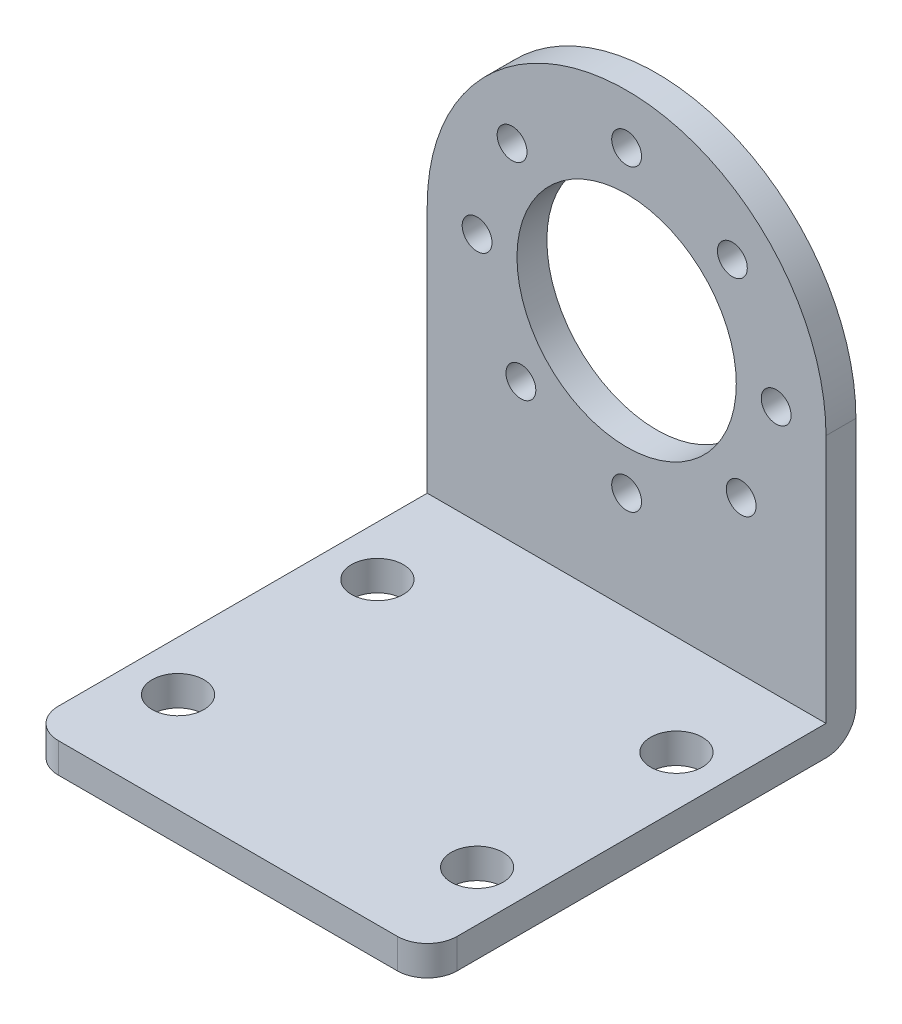
ISO-10303-21;
HEADER;
FILE_DESCRIPTION(('STEP AP214'),'2;1');
FILE_NAME('part.step','',(''),(''),'','','');
FILE_SCHEMA(('AUTOMOTIVE_DESIGN { 1 0 10303 214 1 1 1 1 }'));
ENDSEC;
DATA;
#1=APPLICATION_CONTEXT('core data for automotive mechanical design processes');
#2=APPLICATION_PROTOCOL_DEFINITION('international standard','automotive_design',2000,#1);
#3=PRODUCT_CONTEXT('',#1,'mechanical');
#4=PRODUCT('Part','Part','',(#3));
#5=PRODUCT_RELATED_PRODUCT_CATEGORY('part','',(#4));
#6=PRODUCT_DEFINITION_FORMATION('','',#4);
#7=PRODUCT_DEFINITION_CONTEXT('part definition',#1,'design');
#8=PRODUCT_DEFINITION('design','',#6,#7);
#9=PRODUCT_DEFINITION_SHAPE('','',#8);
#10=(LENGTH_UNIT() NAMED_UNIT(*) SI_UNIT(.MILLI.,.METRE.));
#11=(NAMED_UNIT(*) PLANE_ANGLE_UNIT() SI_UNIT($,.RADIAN.));
#12=(NAMED_UNIT(*) SI_UNIT($,.STERADIAN.) SOLID_ANGLE_UNIT());
#13=UNCERTAINTY_MEASURE_WITH_UNIT(LENGTH_MEASURE(1.E-05),#10,'distance_accuracy_value','');
#14=(GEOMETRIC_REPRESENTATION_CONTEXT(3) GLOBAL_UNCERTAINTY_ASSIGNED_CONTEXT((#13)) GLOBAL_UNIT_ASSIGNED_CONTEXT((#10,
#11,#12)) REPRESENTATION_CONTEXT('',''));
#15=CARTESIAN_POINT('',(0.,0.,0.));
#16=DIRECTION('',(0.,0.,1.));
#17=DIRECTION('',(1.,0.,0.));
#18=AXIS2_PLACEMENT_3D('',#15,#16,#17);
#19=CARTESIAN_POINT('',(0.,0.,3.));
#20=DIRECTION('',(0.,0.,1.));
#21=DIRECTION('',(1.,0.,0.));
#22=AXIS2_PLACEMENT_3D('',#19,#20,#21);
#23=PLANE('',#22);
#24=CARTESIAN_POINT('',(-15.,0.,3.));
#25=DIRECTION('',(0.,0.,1.));
#26=DIRECTION('',(1.,0.,0.));
#27=AXIS2_PLACEMENT_3D('',#24,#25,#26);
#28=CIRCLE('',#27,1.49741367936974);
#29=CARTESIAN_POINT('',(-13.5025863206303,0.,3.));
#30=VERTEX_POINT('',#29);
#31=EDGE_CURVE('E138',#30,#30,#28,.T.);
#32=ORIENTED_EDGE('',*,*,#31,.F.);
#33=EDGE_LOOP('',(#32));
#34=FACE_BOUND('',#33,.T.);
#35=CARTESIAN_POINT('',(-10.6066017177982,-10.6066017177982,3.));
#36=DIRECTION('',(0.,0.,1.));
#37=DIRECTION('',(1.,0.,0.));
#38=AXIS2_PLACEMENT_3D('',#35,#36,#37);
#39=CIRCLE('',#38,1.49741367936974);
#40=CARTESIAN_POINT('',(-9.10918803842847,-10.6066017177982,3.));
#41=VERTEX_POINT('',#40);
#42=EDGE_CURVE('E146',#41,#41,#39,.T.);
#43=ORIENTED_EDGE('',*,*,#42,.F.);
#44=EDGE_LOOP('',(#43));
#45=FACE_BOUND('',#44,.T.);
#46=CARTESIAN_POINT('',(0.,-15.,3.));
#47=DIRECTION('',(0.,0.,1.));
#48=DIRECTION('',(1.,0.,0.));
#49=AXIS2_PLACEMENT_3D('',#46,#47,#48);
#50=CIRCLE('',#49,1.49741367936974);
#51=CARTESIAN_POINT('',(1.49741367936974,-15.,3.));
#52=VERTEX_POINT('',#51);
#53=EDGE_CURVE('E149',#52,#52,#50,.T.);
#54=ORIENTED_EDGE('',*,*,#53,.F.);
#55=EDGE_LOOP('',(#54));
#56=FACE_BOUND('',#55,.T.);
#57=CARTESIAN_POINT('',(11.4906666467847,-9.64181414529811,3.));
#58=DIRECTION('',(0.,0.,1.));
#59=DIRECTION('',(1.,0.,0.));
#60=AXIS2_PLACEMENT_3D('',#57,#58,#59);
#61=CIRCLE('',#60,1.49741367936974);
#62=CARTESIAN_POINT('',(12.9880803261544,-9.64181414529811,3.));
#63=VERTEX_POINT('',#62);
#64=EDGE_CURVE('E152',#63,#63,#61,.T.);
#65=ORIENTED_EDGE('',*,*,#64,.F.);
#66=EDGE_LOOP('',(#65));
#67=FACE_BOUND('',#66,.T.);
#68=CARTESIAN_POINT('',(15.,0.,3.));
#69=DIRECTION('',(0.,0.,1.));
#70=DIRECTION('',(1.,0.,0.));
#71=AXIS2_PLACEMENT_3D('',#68,#69,#70);
#72=CIRCLE('',#71,1.49741367936974);
#73=CARTESIAN_POINT('',(16.4974136793697,0.,3.));
#74=VERTEX_POINT('',#73);
#75=EDGE_CURVE('E155',#74,#74,#72,.T.);
#76=ORIENTED_EDGE('',*,*,#75,.F.);
#77=EDGE_LOOP('',(#76));
#78=FACE_BOUND('',#77,.T.);
#79=CARTESIAN_POINT('',(10.6066017177982,10.6066017177982,3.));
#80=DIRECTION('',(0.,0.,1.));
#81=DIRECTION('',(1.,0.,0.));
#82=AXIS2_PLACEMENT_3D('',#79,#80,#81);
#83=CIRCLE('',#82,1.49741367936974);
#84=CARTESIAN_POINT('',(12.1040153971679,10.6066017177982,3.));
#85=VERTEX_POINT('',#84);
#86=EDGE_CURVE('E158',#85,#85,#83,.T.);
#87=ORIENTED_EDGE('',*,*,#86,.F.);
#88=EDGE_LOOP('',(#87));
#89=FACE_BOUND('',#88,.T.);
#90=CARTESIAN_POINT('',(0.,15.,3.));
#91=DIRECTION('',(0.,0.,1.));
#92=DIRECTION('',(1.,0.,0.));
#93=AXIS2_PLACEMENT_3D('',#90,#91,#92);
#94=CIRCLE('',#93,1.49741367936974);
#95=CARTESIAN_POINT('',(1.49741367936974,15.,3.));
#96=VERTEX_POINT('',#95);
#97=EDGE_CURVE('E161',#96,#96,#94,.T.);
#98=ORIENTED_EDGE('',*,*,#97,.F.);
#99=EDGE_LOOP('',(#98));
#100=FACE_BOUND('',#99,.T.);
#101=CARTESIAN_POINT('',(-11.4906666467847,9.64181414529811,3.));
#102=DIRECTION('',(0.,0.,1.));
#103=DIRECTION('',(1.,0.,0.));
#104=AXIS2_PLACEMENT_3D('',#101,#102,#103);
#105=CIRCLE('',#104,1.49741367936974);
#106=CARTESIAN_POINT('',(-9.99325296741492,9.64181414529811,3.));
#107=VERTEX_POINT('',#106);
#108=EDGE_CURVE('E164',#107,#107,#105,.T.);
#109=ORIENTED_EDGE('',*,*,#108,.F.);
#110=EDGE_LOOP('',(#109));
#111=FACE_BOUND('',#110,.T.);
#112=CARTESIAN_POINT('',(0.,0.,3.));
#113=DIRECTION('',(0.,0.,1.));
#114=DIRECTION('',(1.,0.,0.));
#115=AXIS2_PLACEMENT_3D('',#112,#113,#114);
#116=CIRCLE('',#115,11.);
#117=CARTESIAN_POINT('',(11.,0.,3.));
#118=VERTEX_POINT('',#117);
#119=EDGE_CURVE('E167',#118,#118,#116,.T.);
#120=ORIENTED_EDGE('',*,*,#119,.F.);
#121=EDGE_LOOP('',(#120));
#122=FACE_BOUND('',#121,.T.);
#123=DIRECTION('',(0.,-1.,0.));
#124=VECTOR('',#123,1.);
#125=CARTESIAN_POINT('',(-20.,0.,3.));
#126=LINE('',#125,#124);
#127=CARTESIAN_POINT('',(-20.,0.,3.));
#128=VERTEX_POINT('',#127);
#129=CARTESIAN_POINT('',(-20.,-25.,3.));
#130=VERTEX_POINT('',#129);
#131=EDGE_CURVE('E115',#128,#130,#126,.T.);
#132=ORIENTED_EDGE('',*,*,#131,.T.);
#133=DIRECTION('',(1.,0.,0.));
#134=VECTOR('',#133,1.);
#135=CARTESIAN_POINT('',(-20.,-25.,3.));
#136=LINE('',#135,#134);
#137=CARTESIAN_POINT('',(20.,-25.,3.));
#138=VERTEX_POINT('',#137);
#139=EDGE_CURVE('E123',#130,#138,#136,.T.);
#140=ORIENTED_EDGE('',*,*,#139,.T.);
#141=DIRECTION('',(0.,-1.,0.));
#142=VECTOR('',#141,1.);
#143=CARTESIAN_POINT('',(20.,0.,3.));
#144=LINE('',#143,#142);
#145=CARTESIAN_POINT('',(20.,0.,3.));
#146=VERTEX_POINT('',#145);
#147=EDGE_CURVE('E136',#146,#138,#144,.T.);
#148=ORIENTED_EDGE('',*,*,#147,.F.);
#149=CARTESIAN_POINT('',(0.,0.,3.));
#150=DIRECTION('',(0.,0.,1.));
#151=DIRECTION('',(1.,0.,0.));
#152=AXIS2_PLACEMENT_3D('',#149,#150,#151);
#153=CIRCLE('',#152,20.);
#154=EDGE_CURVE('E134',#146,#128,#153,.T.);
#155=ORIENTED_EDGE('',*,*,#154,.T.);
#156=EDGE_LOOP('',(#132,#140,#148,#155));
#157=FACE_BOUND('',#156,.T.);
#158=ADVANCED_FACE('F40',(#34,#45,#56,#67,#78,#89,#100,#111,#122,#157),#23,.T.);
#159=CARTESIAN_POINT('',(0.,0.,3.));
#160=DIRECTION('',(0.,0.,-1.));
#161=DIRECTION('',(-1.,0.,0.));
#162=AXIS2_PLACEMENT_3D('',#159,#160,#161);
#163=CYLINDRICAL_SURFACE('',#162,20.);
#164=CARTESIAN_POINT('',(0.,0.,0.));
#165=DIRECTION('',(0.,0.,1.));
#166=DIRECTION('',(1.,0.,0.));
#167=AXIS2_PLACEMENT_3D('',#164,#165,#166);
#168=CIRCLE('',#167,20.);
#169=CARTESIAN_POINT('',(20.,0.,0.));
#170=VERTEX_POINT('',#169);
#171=CARTESIAN_POINT('',(-20.,0.,0.));
#172=VERTEX_POINT('',#171);
#173=EDGE_CURVE('E119',#170,#172,#168,.T.);
#174=ORIENTED_EDGE('',*,*,#173,.T.);
#175=DIRECTION('',(0.,0.,-1.));
#176=VECTOR('',#175,1.);
#177=CARTESIAN_POINT('',(-20.,0.,3.));
#178=LINE('',#177,#176);
#179=EDGE_CURVE('E209',#128,#172,#178,.T.);
#180=ORIENTED_EDGE('',*,*,#179,.F.);
#181=ORIENTED_EDGE('',*,*,#154,.F.);
#182=DIRECTION('',(0.,0.,-1.));
#183=VECTOR('',#182,1.);
#184=CARTESIAN_POINT('',(20.,0.,3.));
#185=LINE('',#184,#183);
#186=EDGE_CURVE('E170',#146,#170,#185,.T.);
#187=ORIENTED_EDGE('',*,*,#186,.T.);
#188=EDGE_LOOP('',(#174,#180,#181,#187));
#189=FACE_BOUND('',#188,.T.);
#190=ADVANCED_FACE('F303',(#189),#163,.T.);
#191=CARTESIAN_POINT('',(-20.,0.,3.));
#192=DIRECTION('',(1.,0.,0.));
#193=DIRECTION('',(0.,1.,0.));
#194=AXIS2_PLACEMENT_3D('',#191,#192,#193);
#195=PLANE('',#194);
#196=DIRECTION('',(0.,0.,-1.));
#197=VECTOR('',#196,1.);
#198=CARTESIAN_POINT('',(-20.,-28.,3.));
#199=LINE('',#198,#197);
#200=CARTESIAN_POINT('',(-20.,-28.,40.));
#201=VERTEX_POINT('',#200);
#202=CARTESIAN_POINT('',(-20.,-28.,3.));
#203=VERTEX_POINT('',#202);
#204=EDGE_CURVE('E207',#201,#203,#199,.T.);
#205=ORIENTED_EDGE('',*,*,#204,.F.);
#206=DIRECTION('',(0.,1.,0.));
#207=VECTOR('',#206,1.);
#208=CARTESIAN_POINT('',(-20.,-25.,40.));
#209=LINE('',#208,#207);
#210=CARTESIAN_POINT('',(-20.,-25.,40.));
#211=VERTEX_POINT('',#210);
#212=EDGE_CURVE('E48',#201,#211,#209,.T.);
#213=ORIENTED_EDGE('',*,*,#212,.T.);
#214=DIRECTION('',(0.,0.,-1.));
#215=VECTOR('',#214,1.);
#216=CARTESIAN_POINT('',(-20.,-25.,43.));
#217=LINE('',#216,#215);
#218=EDGE_CURVE('E110',#211,#130,#217,.T.);
#219=ORIENTED_EDGE('',*,*,#218,.T.);
#220=ORIENTED_EDGE('',*,*,#131,.F.);
#221=ORIENTED_EDGE('',*,*,#179,.T.);
#222=DIRECTION('',(0.,-1.,0.));
#223=VECTOR('',#222,1.);
#224=CARTESIAN_POINT('',(-20.,0.,0.));
#225=LINE('',#224,#223);
#226=CARTESIAN_POINT('',(-20.,-25.,0.));
#227=VERTEX_POINT('',#226);
#228=EDGE_CURVE('E173',#172,#227,#225,.T.);
#229=ORIENTED_EDGE('',*,*,#228,.T.);
#230=CARTESIAN_POINT('',(-20.,-25.,3.));
#231=DIRECTION('',(1.,0.,0.));
#232=DIRECTION('',(0.,1.,0.));
#233=AXIS2_PLACEMENT_3D('',#230,#231,#232);
#234=CIRCLE('',#233,3.);
#235=EDGE_CURVE('E60',#227,#203,#234,.F.);
#236=ORIENTED_EDGE('',*,*,#235,.T.);
#237=EDGE_LOOP('',(#205,#213,#219,#220,#221,#229,#236));
#238=FACE_BOUND('',#237,.T.);
#239=ADVANCED_FACE('F112',(#238),#195,.F.);
#240=CARTESIAN_POINT('',(0.,-28.,3.));
#241=DIRECTION('',(0.,1.,0.));
#242=DIRECTION('',(0.,0.,1.));
#243=AXIS2_PLACEMENT_3D('',#240,#241,#242);
#244=PLANE('',#243);
#245=CARTESIAN_POINT('',(15.,-28.,13.));
#246=DIRECTION('',(0.,1.,0.));
#247=DIRECTION('',(0.,0.,1.));
#248=AXIS2_PLACEMENT_3D('',#245,#246,#247);
#249=CIRCLE('',#248,2.6);
#250=CARTESIAN_POINT('',(15.,-28.,15.6));
#251=VERTEX_POINT('',#250);
#252=EDGE_CURVE('E131',#251,#251,#249,.T.);
#253=ORIENTED_EDGE('',*,*,#252,.T.);
#254=EDGE_LOOP('',(#253));
#255=FACE_BOUND('',#254,.T.);
#256=CARTESIAN_POINT('',(15.,-28.,33.));
#257=DIRECTION('',(0.,1.,0.));
#258=DIRECTION('',(0.,0.,1.));
#259=AXIS2_PLACEMENT_3D('',#256,#257,#258);
#260=CIRCLE('',#259,2.6);
#261=CARTESIAN_POINT('',(15.,-28.,35.6));
#262=VERTEX_POINT('',#261);
#263=EDGE_CURVE('E254',#262,#262,#260,.T.);
#264=ORIENTED_EDGE('',*,*,#263,.T.);
#265=EDGE_LOOP('',(#264));
#266=FACE_BOUND('',#265,.T.);
#267=CARTESIAN_POINT('',(-15.,-28.,33.));
#268=DIRECTION('',(0.,1.,0.));
#269=DIRECTION('',(0.,0.,1.));
#270=AXIS2_PLACEMENT_3D('',#267,#268,#269);
#271=CIRCLE('',#270,2.6);
#272=CARTESIAN_POINT('',(-15.,-28.,35.6));
#273=VERTEX_POINT('',#272);
#274=EDGE_CURVE('E257',#273,#273,#271,.T.);
#275=ORIENTED_EDGE('',*,*,#274,.T.);
#276=EDGE_LOOP('',(#275));
#277=FACE_BOUND('',#276,.T.);
#278=CARTESIAN_POINT('',(-15.,-28.,13.));
#279=DIRECTION('',(0.,1.,0.));
#280=DIRECTION('',(0.,0.,1.));
#281=AXIS2_PLACEMENT_3D('',#278,#279,#280);
#282=CIRCLE('',#281,2.6);
#283=CARTESIAN_POINT('',(-15.,-28.,15.6));
#284=VERTEX_POINT('',#283);
#285=EDGE_CURVE('E260',#284,#284,#282,.T.);
#286=ORIENTED_EDGE('',*,*,#285,.T.);
#287=EDGE_LOOP('',(#286));
#288=FACE_BOUND('',#287,.T.);
#289=DIRECTION('',(0.,0.,-1.));
#290=VECTOR('',#289,1.);
#291=CARTESIAN_POINT('',(20.,-28.,3.));
#292=LINE('',#291,#290);
#293=CARTESIAN_POINT('',(20.,-28.,40.));
#294=VERTEX_POINT('',#293);
#295=CARTESIAN_POINT('',(20.,-28.,3.));
#296=VERTEX_POINT('',#295);
#297=EDGE_CURVE('E204',#294,#296,#292,.T.);
#298=ORIENTED_EDGE('',*,*,#297,.F.);
#299=CARTESIAN_POINT('',(17.,-28.,40.));
#300=DIRECTION('',(0.,1.,0.));
#301=DIRECTION('',(0.,0.,1.));
#302=AXIS2_PLACEMENT_3D('',#299,#300,#301);
#303=CIRCLE('',#302,3.);
#304=CARTESIAN_POINT('',(17.,-28.,43.));
#305=VERTEX_POINT('',#304);
#306=EDGE_CURVE('E229',#294,#305,#303,.F.);
#307=ORIENTED_EDGE('',*,*,#306,.T.);
#308=DIRECTION('',(1.,0.,0.));
#309=VECTOR('',#308,1.);
#310=CARTESIAN_POINT('',(-20.,-28.,43.));
#311=LINE('',#310,#309);
#312=CARTESIAN_POINT('',(-17.,-28.,43.));
#313=VERTEX_POINT('',#312);
#314=EDGE_CURVE('E237',#313,#305,#311,.T.);
#315=ORIENTED_EDGE('',*,*,#314,.F.);
#316=CARTESIAN_POINT('',(-17.,-28.,40.));
#317=DIRECTION('',(0.,1.,0.));
#318=DIRECTION('',(0.,0.,1.));
#319=AXIS2_PLACEMENT_3D('',#316,#317,#318);
#320=CIRCLE('',#319,3.);
#321=EDGE_CURVE('E227',#313,#201,#320,.F.);
#322=ORIENTED_EDGE('',*,*,#321,.T.);
#323=ORIENTED_EDGE('',*,*,#204,.T.);
#324=DIRECTION('',(1.,0.,0.));
#325=VECTOR('',#324,1.);
#326=CARTESIAN_POINT('',(0.,-28.,3.));
#327=LINE('',#326,#325);
#328=EDGE_CURVE('E224',#203,#296,#327,.T.);
#329=ORIENTED_EDGE('',*,*,#328,.T.);
#330=EDGE_LOOP('',(#298,#307,#315,#322,#323,#329));
#331=FACE_BOUND('',#330,.T.);
#332=ADVANCED_FACE('F236',(#255,#266,#277,#288,#331),#244,.F.);
#333=CARTESIAN_POINT('',(-11.4906666467847,9.64181414529811,3.));
#334=DIRECTION('',(0.,0.,-1.));
#335=DIRECTION('',(-1.,0.,0.));
#336=AXIS2_PLACEMENT_3D('',#333,#334,#335);
#337=CYLINDRICAL_SURFACE('',#336,1.49741367936974);
#338=ORIENTED_EDGE('',*,*,#108,.T.);
#339=EDGE_LOOP('',(#338));
#340=FACE_BOUND('',#339,.T.);
#341=CARTESIAN_POINT('',(-11.4906666467847,9.64181414529811,0.));
#342=DIRECTION('',(0.,0.,1.));
#343=DIRECTION('',(1.,0.,0.));
#344=AXIS2_PLACEMENT_3D('',#341,#342,#343);
#345=CIRCLE('',#344,1.49741367936974);
#346=CARTESIAN_POINT('',(-9.99325296741492,9.64181414529811,0.));
#347=VERTEX_POINT('',#346);
#348=EDGE_CURVE('E198',#347,#347,#345,.T.);
#349=ORIENTED_EDGE('',*,*,#348,.F.);
#350=EDGE_LOOP('',(#349));
#351=FACE_BOUND('',#350,.T.);
#352=ADVANCED_FACE('F293',(#340,#351),#337,.F.);
#353=CARTESIAN_POINT('',(0.,15.,3.));
#354=DIRECTION('',(0.,0.,-1.));
#355=DIRECTION('',(-1.,0.,0.));
#356=AXIS2_PLACEMENT_3D('',#353,#354,#355);
#357=CYLINDRICAL_SURFACE('',#356,1.49741367936974);
#358=ORIENTED_EDGE('',*,*,#97,.T.);
#359=EDGE_LOOP('',(#358));
#360=FACE_BOUND('',#359,.T.);
#361=CARTESIAN_POINT('',(0.,15.,0.));
#362=DIRECTION('',(0.,0.,1.));
#363=DIRECTION('',(1.,0.,0.));
#364=AXIS2_PLACEMENT_3D('',#361,#362,#363);
#365=CIRCLE('',#364,1.49741367936974);
#366=CARTESIAN_POINT('',(1.49741367936974,15.,0.));
#367=VERTEX_POINT('',#366);
#368=EDGE_CURVE('E195',#367,#367,#365,.T.);
#369=ORIENTED_EDGE('',*,*,#368,.F.);
#370=EDGE_LOOP('',(#369));
#371=FACE_BOUND('',#370,.T.);
#372=ADVANCED_FACE('F300',(#360,#371),#357,.F.);
#373=CARTESIAN_POINT('',(10.6066017177982,10.6066017177982,3.));
#374=DIRECTION('',(0.,0.,-1.));
#375=DIRECTION('',(-1.,0.,0.));
#376=AXIS2_PLACEMENT_3D('',#373,#374,#375);
#377=CYLINDRICAL_SURFACE('',#376,1.49741367936974);
#378=ORIENTED_EDGE('',*,*,#86,.T.);
#379=EDGE_LOOP('',(#378));
#380=FACE_BOUND('',#379,.T.);
#381=CARTESIAN_POINT('',(10.6066017177982,10.6066017177982,0.));
#382=DIRECTION('',(0.,0.,1.));
#383=DIRECTION('',(1.,0.,0.));
#384=AXIS2_PLACEMENT_3D('',#381,#382,#383);
#385=CIRCLE('',#384,1.49741367936974);
#386=CARTESIAN_POINT('',(12.1040153971679,10.6066017177982,0.));
#387=VERTEX_POINT('',#386);
#388=EDGE_CURVE('E192',#387,#387,#385,.T.);
#389=ORIENTED_EDGE('',*,*,#388,.F.);
#390=EDGE_LOOP('',(#389));
#391=FACE_BOUND('',#390,.T.);
#392=ADVANCED_FACE('F327',(#380,#391),#377,.F.);
#393=CARTESIAN_POINT('',(15.,0.,3.));
#394=DIRECTION('',(0.,0.,-1.));
#395=DIRECTION('',(-1.,0.,0.));
#396=AXIS2_PLACEMENT_3D('',#393,#394,#395);
#397=CYLINDRICAL_SURFACE('',#396,1.49741367936974);
#398=ORIENTED_EDGE('',*,*,#75,.T.);
#399=EDGE_LOOP('',(#398));
#400=FACE_BOUND('',#399,.T.);
#401=CARTESIAN_POINT('',(15.,0.,0.));
#402=DIRECTION('',(0.,0.,1.));
#403=DIRECTION('',(1.,0.,0.));
#404=AXIS2_PLACEMENT_3D('',#401,#402,#403);
#405=CIRCLE('',#404,1.49741367936974);
#406=CARTESIAN_POINT('',(16.4974136793697,0.,0.));
#407=VERTEX_POINT('',#406);
#408=EDGE_CURVE('E189',#407,#407,#405,.T.);
#409=ORIENTED_EDGE('',*,*,#408,.F.);
#410=EDGE_LOOP('',(#409));
#411=FACE_BOUND('',#410,.T.);
#412=ADVANCED_FACE('F331',(#400,#411),#397,.F.);
#413=CARTESIAN_POINT('',(11.4906666467847,-9.64181414529811,3.));
#414=DIRECTION('',(0.,0.,-1.));
#415=DIRECTION('',(-1.,0.,0.));
#416=AXIS2_PLACEMENT_3D('',#413,#414,#415);
#417=CYLINDRICAL_SURFACE('',#416,1.49741367936974);
#418=ORIENTED_EDGE('',*,*,#64,.T.);
#419=EDGE_LOOP('',(#418));
#420=FACE_BOUND('',#419,.T.);
#421=CARTESIAN_POINT('',(11.4906666467847,-9.64181414529811,0.));
#422=DIRECTION('',(0.,0.,1.));
#423=DIRECTION('',(1.,0.,0.));
#424=AXIS2_PLACEMENT_3D('',#421,#422,#423);
#425=CIRCLE('',#424,1.49741367936974);
#426=CARTESIAN_POINT('',(12.9880803261544,-9.64181414529811,0.));
#427=VERTEX_POINT('',#426);
#428=EDGE_CURVE('E186',#427,#427,#425,.T.);
#429=ORIENTED_EDGE('',*,*,#428,.F.);
#430=EDGE_LOOP('',(#429));
#431=FACE_BOUND('',#430,.T.);
#432=ADVANCED_FACE('F335',(#420,#431),#417,.F.);
#433=CARTESIAN_POINT('',(0.,-15.,3.));
#434=DIRECTION('',(0.,0.,-1.));
#435=DIRECTION('',(-1.,0.,0.));
#436=AXIS2_PLACEMENT_3D('',#433,#434,#435);
#437=CYLINDRICAL_SURFACE('',#436,1.49741367936974);
#438=ORIENTED_EDGE('',*,*,#53,.T.);
#439=EDGE_LOOP('',(#438));
#440=FACE_BOUND('',#439,.T.);
#441=CARTESIAN_POINT('',(0.,-15.,0.));
#442=DIRECTION('',(0.,0.,1.));
#443=DIRECTION('',(1.,0.,0.));
#444=AXIS2_PLACEMENT_3D('',#441,#442,#443);
#445=CIRCLE('',#444,1.49741367936974);
#446=CARTESIAN_POINT('',(1.49741367936974,-15.,0.));
#447=VERTEX_POINT('',#446);
#448=EDGE_CURVE('E183',#447,#447,#445,.T.);
#449=ORIENTED_EDGE('',*,*,#448,.F.);
#450=EDGE_LOOP('',(#449));
#451=FACE_BOUND('',#450,.T.);
#452=ADVANCED_FACE('F339',(#440,#451),#437,.F.);
#453=CARTESIAN_POINT('',(-10.6066017177982,-10.6066017177982,3.));
#454=DIRECTION('',(0.,0.,-1.));
#455=DIRECTION('',(-1.,0.,0.));
#456=AXIS2_PLACEMENT_3D('',#453,#454,#455);
#457=CYLINDRICAL_SURFACE('',#456,1.49741367936974);
#458=ORIENTED_EDGE('',*,*,#42,.T.);
#459=EDGE_LOOP('',(#458));
#460=FACE_BOUND('',#459,.T.);
#461=CARTESIAN_POINT('',(-10.6066017177982,-10.6066017177982,0.));
#462=DIRECTION('',(0.,0.,1.));
#463=DIRECTION('',(1.,0.,0.));
#464=AXIS2_PLACEMENT_3D('',#461,#462,#463);
#465=CIRCLE('',#464,1.49741367936974);
#466=CARTESIAN_POINT('',(-9.10918803842847,-10.6066017177982,0.));
#467=VERTEX_POINT('',#466);
#468=EDGE_CURVE('E180',#467,#467,#465,.T.);
#469=ORIENTED_EDGE('',*,*,#468,.F.);
#470=EDGE_LOOP('',(#469));
#471=FACE_BOUND('',#470,.T.);
#472=ADVANCED_FACE('F343',(#460,#471),#457,.F.);
#473=CARTESIAN_POINT('',(-15.,0.,3.));
#474=DIRECTION('',(0.,0.,-1.));
#475=DIRECTION('',(-1.,0.,0.));
#476=AXIS2_PLACEMENT_3D('',#473,#474,#475);
#477=CYLINDRICAL_SURFACE('',#476,1.49741367936974);
#478=ORIENTED_EDGE('',*,*,#31,.T.);
#479=EDGE_LOOP('',(#478));
#480=FACE_BOUND('',#479,.T.);
#481=CARTESIAN_POINT('',(-15.,0.,0.));
#482=DIRECTION('',(0.,0.,1.));
#483=DIRECTION('',(1.,0.,0.));
#484=AXIS2_PLACEMENT_3D('',#481,#482,#483);
#485=CIRCLE('',#484,1.49741367936974);
#486=CARTESIAN_POINT('',(-13.5025863206303,0.,0.));
#487=VERTEX_POINT('',#486);
#488=EDGE_CURVE('E177',#487,#487,#485,.T.);
#489=ORIENTED_EDGE('',*,*,#488,.F.);
#490=EDGE_LOOP('',(#489));
#491=FACE_BOUND('',#490,.T.);
#492=ADVANCED_FACE('F347',(#480,#491),#477,.F.);
#493=CARTESIAN_POINT('',(20.,0.,3.));
#494=DIRECTION('',(1.,0.,0.));
#495=DIRECTION('',(0.,1.,0.));
#496=AXIS2_PLACEMENT_3D('',#493,#494,#495);
#497=PLANE('',#496);
#498=DIRECTION('',(0.,0.,-1.));
#499=VECTOR('',#498,1.);
#500=CARTESIAN_POINT('',(20.,-25.,43.));
#501=LINE('',#500,#499);
#502=CARTESIAN_POINT('',(20.,-25.,40.));
#503=VERTEX_POINT('',#502);
#504=EDGE_CURVE('E120',#503,#138,#501,.T.);
#505=ORIENTED_EDGE('',*,*,#504,.F.);
#506=DIRECTION('',(0.,1.,0.));
#507=VECTOR('',#506,1.);
#508=CARTESIAN_POINT('',(20.,0.,40.));
#509=LINE('',#508,#507);
#510=EDGE_CURVE('E222',#503,#294,#509,.F.);
#511=ORIENTED_EDGE('',*,*,#510,.T.);
#512=ORIENTED_EDGE('',*,*,#297,.T.);
#513=CARTESIAN_POINT('',(20.,-25.,3.));
#514=DIRECTION('',(1.,0.,0.));
#515=DIRECTION('',(0.,1.,0.));
#516=AXIS2_PLACEMENT_3D('',#513,#514,#515);
#517=CIRCLE('',#516,3.);
#518=CARTESIAN_POINT('',(20.,-25.,0.));
#519=VERTEX_POINT('',#518);
#520=EDGE_CURVE('E220',#296,#519,#517,.T.);
#521=ORIENTED_EDGE('',*,*,#520,.T.);
#522=DIRECTION('',(0.,-1.,0.));
#523=VECTOR('',#522,1.);
#524=CARTESIAN_POINT('',(20.,0.,0.));
#525=LINE('',#524,#523);
#526=EDGE_CURVE('E175',#170,#519,#525,.T.);
#527=ORIENTED_EDGE('',*,*,#526,.F.);
#528=ORIENTED_EDGE('',*,*,#186,.F.);
#529=ORIENTED_EDGE('',*,*,#147,.T.);
#530=EDGE_LOOP('',(#505,#511,#512,#521,#527,#528,#529));
#531=FACE_BOUND('',#530,.T.);
#532=ADVANCED_FACE('F249',(#531),#497,.T.);
#533=CARTESIAN_POINT('',(0.,0.,3.));
#534=DIRECTION('',(0.,0.,-1.));
#535=DIRECTION('',(-1.,0.,0.));
#536=AXIS2_PLACEMENT_3D('',#533,#534,#535);
#537=CYLINDRICAL_SURFACE('',#536,11.);
#538=ORIENTED_EDGE('',*,*,#119,.T.);
#539=EDGE_LOOP('',(#538));
#540=FACE_BOUND('',#539,.T.);
#541=CARTESIAN_POINT('',(0.,0.,0.));
#542=DIRECTION('',(0.,0.,1.));
#543=DIRECTION('',(1.,0.,0.));
#544=AXIS2_PLACEMENT_3D('',#541,#542,#543);
#545=CIRCLE('',#544,11.);
#546=CARTESIAN_POINT('',(11.,0.,0.));
#547=VERTEX_POINT('',#546);
#548=EDGE_CURVE('E140',#547,#547,#545,.T.);
#549=ORIENTED_EDGE('',*,*,#548,.F.);
#550=EDGE_LOOP('',(#549));
#551=FACE_BOUND('',#550,.T.);
#552=ADVANCED_FACE('F321',(#540,#551),#537,.F.);
#553=CARTESIAN_POINT('',(0.,0.,0.));
#554=DIRECTION('',(0.,0.,1.));
#555=DIRECTION('',(1.,0.,0.));
#556=AXIS2_PLACEMENT_3D('',#553,#554,#555);
#557=PLANE('',#556);
#558=ORIENTED_EDGE('',*,*,#526,.T.);
#559=DIRECTION('',(1.,0.,0.));
#560=VECTOR('',#559,1.);
#561=CARTESIAN_POINT('',(0.,-25.,0.));
#562=LINE('',#561,#560);
#563=EDGE_CURVE('E11',#519,#227,#562,.F.);
#564=ORIENTED_EDGE('',*,*,#563,.T.);
#565=ORIENTED_EDGE('',*,*,#228,.F.);
#566=ORIENTED_EDGE('',*,*,#173,.F.);
#567=EDGE_LOOP('',(#558,#564,#565,#566));
#568=FACE_BOUND('',#567,.T.);
#569=ORIENTED_EDGE('',*,*,#488,.T.);
#570=EDGE_LOOP('',(#569));
#571=FACE_BOUND('',#570,.T.);
#572=ORIENTED_EDGE('',*,*,#468,.T.);
#573=EDGE_LOOP('',(#572));
#574=FACE_BOUND('',#573,.T.);
#575=ORIENTED_EDGE('',*,*,#448,.T.);
#576=EDGE_LOOP('',(#575));
#577=FACE_BOUND('',#576,.T.);
#578=ORIENTED_EDGE('',*,*,#428,.T.);
#579=EDGE_LOOP('',(#578));
#580=FACE_BOUND('',#579,.T.);
#581=ORIENTED_EDGE('',*,*,#408,.T.);
#582=EDGE_LOOP('',(#581));
#583=FACE_BOUND('',#582,.T.);
#584=ORIENTED_EDGE('',*,*,#388,.T.);
#585=EDGE_LOOP('',(#584));
#586=FACE_BOUND('',#585,.T.);
#587=ORIENTED_EDGE('',*,*,#368,.T.);
#588=EDGE_LOOP('',(#587));
#589=FACE_BOUND('',#588,.T.);
#590=ORIENTED_EDGE('',*,*,#348,.T.);
#591=EDGE_LOOP('',(#590));
#592=FACE_BOUND('',#591,.T.);
#593=ORIENTED_EDGE('',*,*,#548,.T.);
#594=EDGE_LOOP('',(#593));
#595=FACE_BOUND('',#594,.T.);
#596=ADVANCED_FACE('F281',(#568,#571,#574,#577,#580,#583,#586,#589,#592,#595),#557,.F.);
#597=CARTESIAN_POINT('',(-20.,-25.,43.));
#598=DIRECTION('',(0.,1.,0.));
#599=DIRECTION('',(0.,0.,1.));
#600=AXIS2_PLACEMENT_3D('',#597,#598,#599);
#601=PLANE('',#600);
#602=CARTESIAN_POINT('',(15.,-25.,13.));
#603=DIRECTION('',(0.,1.,0.));
#604=DIRECTION('',(0.,0.,1.));
#605=AXIS2_PLACEMENT_3D('',#602,#603,#604);
#606=CIRCLE('',#605,2.6);
#607=CARTESIAN_POINT('',(15.,-25.,15.6));
#608=VERTEX_POINT('',#607);
#609=EDGE_CURVE('E267',#608,#608,#606,.T.);
#610=ORIENTED_EDGE('',*,*,#609,.F.);
#611=EDGE_LOOP('',(#610));
#612=FACE_BOUND('',#611,.T.);
#613=CARTESIAN_POINT('',(15.,-25.,33.));
#614=DIRECTION('',(0.,1.,0.));
#615=DIRECTION('',(0.,0.,1.));
#616=AXIS2_PLACEMENT_3D('',#613,#614,#615);
#617=CIRCLE('',#616,2.6);
#618=CARTESIAN_POINT('',(15.,-25.,35.6));
#619=VERTEX_POINT('',#618);
#620=EDGE_CURVE('E270',#619,#619,#617,.T.);
#621=ORIENTED_EDGE('',*,*,#620,.F.);
#622=EDGE_LOOP('',(#621));
#623=FACE_BOUND('',#622,.T.);
#624=CARTESIAN_POINT('',(-15.,-25.,33.));
#625=DIRECTION('',(0.,1.,0.));
#626=DIRECTION('',(0.,0.,1.));
#627=AXIS2_PLACEMENT_3D('',#624,#625,#626);
#628=CIRCLE('',#627,2.6);
#629=CARTESIAN_POINT('',(-15.,-25.,35.6));
#630=VERTEX_POINT('',#629);
#631=EDGE_CURVE('E266',#630,#630,#628,.T.);
#632=ORIENTED_EDGE('',*,*,#631,.F.);
#633=EDGE_LOOP('',(#632));
#634=FACE_BOUND('',#633,.T.);
#635=CARTESIAN_POINT('',(-15.,-25.,13.));
#636=DIRECTION('',(0.,1.,0.));
#637=DIRECTION('',(0.,0.,1.));
#638=AXIS2_PLACEMENT_3D('',#635,#636,#637);
#639=CIRCLE('',#638,2.6);
#640=CARTESIAN_POINT('',(-15.,-25.,15.6));
#641=VERTEX_POINT('',#640);
#642=EDGE_CURVE('E263',#641,#641,#639,.T.);
#643=ORIENTED_EDGE('',*,*,#642,.F.);
#644=EDGE_LOOP('',(#643));
#645=FACE_BOUND('',#644,.T.);
#646=DIRECTION('',(1.,0.,0.));
#647=VECTOR('',#646,1.);
#648=CARTESIAN_POINT('',(-20.,-25.,43.));
#649=LINE('',#648,#647);
#650=CARTESIAN_POINT('',(-17.,-25.,43.));
#651=VERTEX_POINT('',#650);
#652=CARTESIAN_POINT('',(17.,-25.,43.));
#653=VERTEX_POINT('',#652);
#654=EDGE_CURVE('E130',#651,#653,#649,.T.);
#655=ORIENTED_EDGE('',*,*,#654,.T.);
#656=CARTESIAN_POINT('',(17.,-25.,40.));
#657=DIRECTION('',(0.,1.,0.));
#658=DIRECTION('',(0.,0.,1.));
#659=AXIS2_PLACEMENT_3D('',#656,#657,#658);
#660=CIRCLE('',#659,3.);
#661=EDGE_CURVE('E218',#653,#503,#660,.T.);
#662=ORIENTED_EDGE('',*,*,#661,.T.);
#663=ORIENTED_EDGE('',*,*,#504,.T.);
#664=ORIENTED_EDGE('',*,*,#139,.F.);
#665=ORIENTED_EDGE('',*,*,#218,.F.);
#666=CARTESIAN_POINT('',(-17.,-25.,40.));
#667=DIRECTION('',(0.,1.,0.));
#668=DIRECTION('',(0.,0.,1.));
#669=AXIS2_PLACEMENT_3D('',#666,#667,#668);
#670=CIRCLE('',#669,3.);
#671=EDGE_CURVE('E216',#211,#651,#670,.T.);
#672=ORIENTED_EDGE('',*,*,#671,.T.);
#673=EDGE_LOOP('',(#655,#662,#663,#664,#665,#672));
#674=FACE_BOUND('',#673,.T.);
#675=ADVANCED_FACE('F125',(#612,#623,#634,#645,#674),#601,.T.);
#676=CARTESIAN_POINT('',(0.,0.,43.));
#677=DIRECTION('',(0.,0.,1.));
#678=DIRECTION('',(1.,0.,0.));
#679=AXIS2_PLACEMENT_3D('',#676,#677,#678);
#680=PLANE('',#679);
#681=ORIENTED_EDGE('',*,*,#314,.T.);
#682=DIRECTION('',(0.,1.,0.));
#683=VECTOR('',#682,1.);
#684=CARTESIAN_POINT('',(17.,0.,43.));
#685=LINE('',#684,#683);
#686=EDGE_CURVE('E213',#305,#653,#685,.T.);
#687=ORIENTED_EDGE('',*,*,#686,.T.);
#688=ORIENTED_EDGE('',*,*,#654,.F.);
#689=DIRECTION('',(0.,1.,0.));
#690=VECTOR('',#689,1.);
#691=CARTESIAN_POINT('',(-17.,-28.,43.));
#692=LINE('',#691,#690);
#693=EDGE_CURVE('E211',#651,#313,#692,.F.);
#694=ORIENTED_EDGE('',*,*,#693,.T.);
#695=EDGE_LOOP('',(#681,#687,#688,#694));
#696=FACE_BOUND('',#695,.T.);
#697=ADVANCED_FACE('F243',(#696),#680,.T.);
#698=CARTESIAN_POINT('',(-15.,-65.,13.));
#699=DIRECTION('',(0.,1.,0.));
#700=DIRECTION('',(0.,0.,1.));
#701=AXIS2_PLACEMENT_3D('',#698,#699,#700);
#702=CYLINDRICAL_SURFACE('',#701,2.6);
#703=ORIENTED_EDGE('',*,*,#642,.T.);
#704=EDGE_LOOP('',(#703));
#705=FACE_BOUND('',#704,.T.);
#706=ORIENTED_EDGE('',*,*,#285,.F.);
#707=EDGE_LOOP('',(#706));
#708=FACE_BOUND('',#707,.T.);
#709=ADVANCED_FACE('F286',(#705,#708),#702,.F.);
#710=CARTESIAN_POINT('',(-15.,-65.,33.));
#711=DIRECTION('',(0.,1.,0.));
#712=DIRECTION('',(0.,0.,1.));
#713=AXIS2_PLACEMENT_3D('',#710,#711,#712);
#714=CYLINDRICAL_SURFACE('',#713,2.6);
#715=ORIENTED_EDGE('',*,*,#631,.T.);
#716=EDGE_LOOP('',(#715));
#717=FACE_BOUND('',#716,.T.);
#718=ORIENTED_EDGE('',*,*,#274,.F.);
#719=EDGE_LOOP('',(#718));
#720=FACE_BOUND('',#719,.T.);
#721=ADVANCED_FACE('F276',(#717,#720),#714,.F.);
#722=CARTESIAN_POINT('',(15.,-65.,33.));
#723=DIRECTION('',(0.,1.,0.));
#724=DIRECTION('',(0.,0.,1.));
#725=AXIS2_PLACEMENT_3D('',#722,#723,#724);
#726=CYLINDRICAL_SURFACE('',#725,2.6);
#727=ORIENTED_EDGE('',*,*,#620,.T.);
#728=EDGE_LOOP('',(#727));
#729=FACE_BOUND('',#728,.T.);
#730=ORIENTED_EDGE('',*,*,#263,.F.);
#731=EDGE_LOOP('',(#730));
#732=FACE_BOUND('',#731,.T.);
#733=ADVANCED_FACE('F384',(#729,#732),#726,.F.);
#734=CARTESIAN_POINT('',(15.,-65.,13.));
#735=DIRECTION('',(0.,1.,0.));
#736=DIRECTION('',(0.,0.,1.));
#737=AXIS2_PLACEMENT_3D('',#734,#735,#736);
#738=CYLINDRICAL_SURFACE('',#737,2.6);
#739=ORIENTED_EDGE('',*,*,#609,.T.);
#740=EDGE_LOOP('',(#739));
#741=FACE_BOUND('',#740,.T.);
#742=ORIENTED_EDGE('',*,*,#252,.F.);
#743=EDGE_LOOP('',(#742));
#744=FACE_BOUND('',#743,.T.);
#745=ADVANCED_FACE('F391',(#741,#744),#738,.F.);
#746=CARTESIAN_POINT('',(17.,0.,40.));
#747=DIRECTION('',(0.,1.,0.));
#748=DIRECTION('',(-1.,0.,0.));
#749=AXIS2_PLACEMENT_3D('',#746,#747,#748);
#750=CYLINDRICAL_SURFACE('',#749,3.);
#751=ORIENTED_EDGE('',*,*,#306,.F.);
#752=ORIENTED_EDGE('',*,*,#510,.F.);
#753=ORIENTED_EDGE('',*,*,#661,.F.);
#754=ORIENTED_EDGE('',*,*,#686,.F.);
#755=EDGE_LOOP('',(#751,#752,#753,#754));
#756=FACE_BOUND('',#755,.T.);
#757=ADVANCED_FACE('F247',(#756),#750,.T.);
#758=CARTESIAN_POINT('',(-17.,0.,40.));
#759=DIRECTION('',(0.,-1.,0.));
#760=DIRECTION('',(1.,0.,0.));
#761=AXIS2_PLACEMENT_3D('',#758,#759,#760);
#762=CYLINDRICAL_SURFACE('',#761,3.);
#763=ORIENTED_EDGE('',*,*,#321,.F.);
#764=ORIENTED_EDGE('',*,*,#693,.F.);
#765=ORIENTED_EDGE('',*,*,#671,.F.);
#766=ORIENTED_EDGE('',*,*,#212,.F.);
#767=EDGE_LOOP('',(#763,#764,#765,#766));
#768=FACE_BOUND('',#767,.T.);
#769=ADVANCED_FACE('F406',(#768),#762,.T.);
#770=CARTESIAN_POINT('',(0.,-25.,3.));
#771=DIRECTION('',(1.,0.,0.));
#772=DIRECTION('',(0.,0.,-1.));
#773=AXIS2_PLACEMENT_3D('',#770,#771,#772);
#774=CYLINDRICAL_SURFACE('',#773,3.);
#775=ORIENTED_EDGE('',*,*,#235,.F.);
#776=ORIENTED_EDGE('',*,*,#563,.F.);
#777=ORIENTED_EDGE('',*,*,#520,.F.);
#778=ORIENTED_EDGE('',*,*,#328,.F.);
#779=EDGE_LOOP('',(#775,#776,#777,#778));
#780=FACE_BOUND('',#779,.T.);
#781=ADVANCED_FACE('F42',(#780),#774,.T.);
#782=CLOSED_SHELL('',(#158,#190,#239,#332,#352,#372,#392,#412,#432,#452,#472,#492,#532,#552,
#596,#675,#697,#709,#721,#733,#745,#757,#769,#781));
#783=MANIFOLD_SOLID_BREP('B2',#782);
#784=ADVANCED_BREP_SHAPE_REPRESENTATION('',(#18,#783),#14);
#785=SHAPE_DEFINITION_REPRESENTATION(#9,#784);
ENDSEC;
END-ISO-10303-21;
